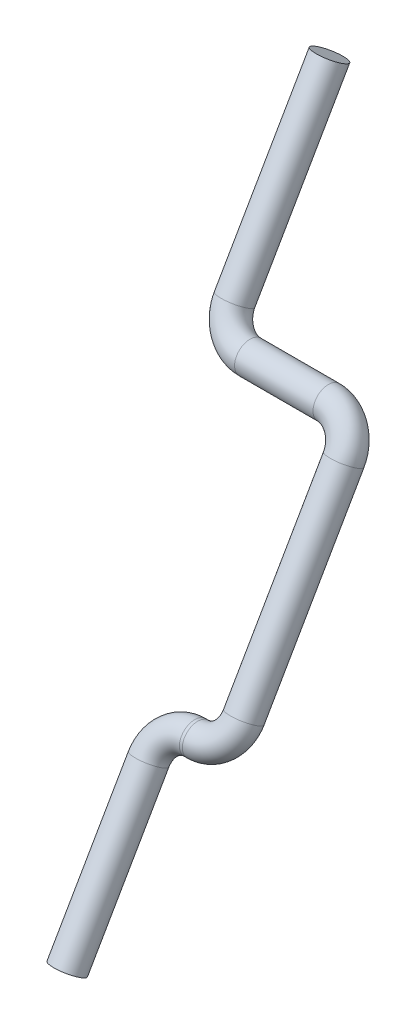
ISO-10303-21;
HEADER;
FILE_DESCRIPTION(('STEP AP214'),'2;1');
FILE_NAME('part.step','',(''),(''),'','','');
FILE_SCHEMA(('AUTOMOTIVE_DESIGN { 1 0 10303 214 1 1 1 1 }'));
ENDSEC;
DATA;
#1=APPLICATION_CONTEXT('core data for automotive mechanical design processes');
#2=APPLICATION_PROTOCOL_DEFINITION('international standard','automotive_design',2000,#1);
#3=PRODUCT_CONTEXT('',#1,'mechanical');
#4=PRODUCT('Part','Part','',(#3));
#5=PRODUCT_RELATED_PRODUCT_CATEGORY('part','',(#4));
#6=PRODUCT_DEFINITION_FORMATION('','',#4);
#7=PRODUCT_DEFINITION_CONTEXT('part definition',#1,'design');
#8=PRODUCT_DEFINITION('design','',#6,#7);
#9=PRODUCT_DEFINITION_SHAPE('','',#8);
#10=(LENGTH_UNIT() NAMED_UNIT(*) SI_UNIT(.MILLI.,.METRE.));
#11=(NAMED_UNIT(*) PLANE_ANGLE_UNIT() SI_UNIT($,.RADIAN.));
#12=(NAMED_UNIT(*) SI_UNIT($,.STERADIAN.) SOLID_ANGLE_UNIT());
#13=UNCERTAINTY_MEASURE_WITH_UNIT(LENGTH_MEASURE(1.E-05),#10,'distance_accuracy_value','');
#14=(GEOMETRIC_REPRESENTATION_CONTEXT(3) GLOBAL_UNCERTAINTY_ASSIGNED_CONTEXT((#13)) GLOBAL_UNIT_ASSIGNED_CONTEXT((#10,
#11,#12)) REPRESENTATION_CONTEXT('',''));
#15=CARTESIAN_POINT('',(0.,0.,0.));
#16=DIRECTION('',(0.,0.,1.));
#17=DIRECTION('',(1.,0.,0.));
#18=AXIS2_PLACEMENT_3D('',#15,#16,#17);
#19=CARTESIAN_POINT('',(-35.9480532512372,25.4978861657786,15.4144292044763));
#20=DIRECTION('',(0.,-0.866025403784439,0.5));
#21=DIRECTION('',(0.,-0.5,-0.866025403784439));
#22=AXIS2_PLACEMENT_3D('',#19,#20,#21);
#23=PLANE('',#22);
#24=CARTESIAN_POINT('',(-35.9480532512372,25.4978861657786,15.4144292044763));
#25=DIRECTION('',(0.,0.866025403784438,-0.5));
#26=DIRECTION('',(0.,0.5,0.866025403784438));
#27=AXIS2_PLACEMENT_3D('',#24,#25,#26);
#28=CIRCLE('',#27,0.499999999999999);
#29=CARTESIAN_POINT('',(-35.9480532512372,25.7478861657786,15.8474419063686));
#30=VERTEX_POINT('',#29);
#31=EDGE_CURVE('E17',#30,#30,#28,.F.);
#32=ORIENTED_EDGE('',*,*,#31,.F.);
#33=EDGE_LOOP('',(#32));
#34=FACE_BOUND('',#33,.T.);
#35=ADVANCED_FACE('F14',(#34),#23,.F.);
#36=CARTESIAN_POINT('',(-35.9480532512372,20.1505890965448,18.5016926068354));
#37=DIRECTION('',(0.,0.866025403784438,-0.5));
#38=DIRECTION('',(0.,0.5,0.866025403784438));
#39=AXIS2_PLACEMENT_3D('',#36,#37,#38);
#40=CYLINDRICAL_SURFACE('',#39,0.499999999999999);
#41=CARTESIAN_POINT('',(-35.9480532512371,20.1505890965447,18.5016926068354));
#42=DIRECTION('',(0.,0.866025403784439,-0.5));
#43=DIRECTION('',(-1.,0.,0.));
#44=AXIS2_PLACEMENT_3D('',#41,#42,#43);
#45=CIRCLE('',#44,0.5);
#46=CARTESIAN_POINT('',(-36.4480532512371,20.1505890965447,18.5016926068354));
#47=VERTEX_POINT('',#46);
#48=EDGE_CURVE('E85',#47,#47,#45,.F.);
#49=ORIENTED_EDGE('',*,*,#48,.F.);
#50=EDGE_LOOP('',(#49));
#51=FACE_BOUND('',#50,.T.);
#52=ORIENTED_EDGE('',*,*,#31,.T.);
#53=EDGE_LOOP('',(#52));
#54=FACE_BOUND('',#53,.T.);
#55=ADVANCED_FACE('F100',(#51,#54),#40,.T.);
#56=CARTESIAN_POINT('',(-33.4930692562999,6.47045995486214,26.3999188493347));
#57=DIRECTION('',(0.,-0.866025403784439,0.5));
#58=DIRECTION('',(0.,-0.5,-0.866025403784439));
#59=AXIS2_PLACEMENT_3D('',#56,#57,#58);
#60=PLANE('',#59);
#61=CARTESIAN_POINT('',(-33.4930692562999,6.47045995486214,26.3999188493347));
#62=DIRECTION('',(0.,-0.866025403784438,0.5));
#63=DIRECTION('',(0.,-0.5,-0.866025403784438));
#64=AXIS2_PLACEMENT_3D('',#61,#62,#63);
#65=CIRCLE('',#64,0.499999999999999);
#66=CARTESIAN_POINT('',(-33.4930692562999,6.22045995486214,25.9669061474425));
#67=VERTEX_POINT('',#66);
#68=EDGE_CURVE('E88',#67,#67,#65,.F.);
#69=ORIENTED_EDGE('',*,*,#68,.F.);
#70=EDGE_LOOP('',(#69));
#71=FACE_BOUND('',#70,.T.);
#72=ADVANCED_FACE('F78',(#71),#60,.T.);
#73=CARTESIAN_POINT('',(-34.9480532512372,20.1505890965448,18.5016926068354));
#74=DIRECTION('',(0.,-0.5,-0.866025403784439));
#75=DIRECTION('',(0.,-0.866025403784439,0.5));
#76=AXIS2_PLACEMENT_3D('',#73,#74,#75);
#77=TOROIDAL_SURFACE('',#76,1.,0.5);
#78=CARTESIAN_POINT('',(-34.9480532512372,19.2845636927603,19.0016926068354));
#79=DIRECTION('',(-1.,0.,0.));
#80=DIRECTION('',(0.,-1.,0.));
#81=AXIS2_PLACEMENT_3D('',#78,#79,#80);
#82=CIRCLE('',#81,0.5);
#83=CARTESIAN_POINT('',(-34.9480532512372,18.7845636927603,19.0016926068354));
#84=VERTEX_POINT('',#83);
#85=EDGE_CURVE('E61',#84,#84,#82,.F.);
#86=ORIENTED_EDGE('',*,*,#85,.F.);
#87=EDGE_LOOP('',(#86));
#88=FACE_BOUND('',#87,.T.);
#89=ORIENTED_EDGE('',*,*,#48,.T.);
#90=EDGE_LOOP('',(#89));
#91=FACE_BOUND('',#90,.T.);
#92=ADVANCED_FACE('F74',(#88,#91),#77,.T.);
#93=CARTESIAN_POINT('',(-33.4930692562999,11.0573614665481,23.7516700268165));
#94=DIRECTION('',(0.,-0.866025403784438,0.5));
#95=DIRECTION('',(0.,-0.5,-0.866025403784438));
#96=AXIS2_PLACEMENT_3D('',#93,#94,#95);
#97=CYLINDRICAL_SURFACE('',#96,0.499999999999999);
#98=CARTESIAN_POINT('',(-33.4930692562999,11.0573614665481,23.7516700268166));
#99=DIRECTION('',(0.,0.866025403784439,-0.5));
#100=DIRECTION('',(-1.,0.,0.));
#101=AXIS2_PLACEMENT_3D('',#98,#99,#100);
#102=CIRCLE('',#101,0.5);
#103=CARTESIAN_POINT('',(-33.9930692562999,11.0573614665481,23.7516700268166));
#104=VERTEX_POINT('',#103);
#105=EDGE_CURVE('E58',#104,#104,#102,.T.);
#106=ORIENTED_EDGE('',*,*,#105,.F.);
#107=EDGE_LOOP('',(#106));
#108=FACE_BOUND('',#107,.T.);
#109=ORIENTED_EDGE('',*,*,#68,.T.);
#110=EDGE_LOOP('',(#109));
#111=FACE_BOUND('',#110,.T.);
#112=ADVANCED_FACE('F70',(#108,#111),#97,.T.);
#113=CARTESIAN_POINT('',(-32.3974457071617,19.2845636927603,19.0016926068354));
#114=DIRECTION('',(-1.,0.,0.));
#115=DIRECTION('',(0.,-1.,0.));
#116=AXIS2_PLACEMENT_3D('',#113,#114,#115);
#117=CYLINDRICAL_SURFACE('',#116,0.5);
#118=CARTESIAN_POINT('',(-32.3974457071616,19.2845636927603,19.0016926068354));
#119=DIRECTION('',(-1.,0.,0.));
#120=DIRECTION('',(0.,0.866025403784438,-0.500000000000002));
#121=AXIS2_PLACEMENT_3D('',#118,#119,#120);
#122=CIRCLE('',#121,0.5);
#123=CARTESIAN_POINT('',(-32.3974457071616,19.7175763946526,18.7516926068354));
#124=VERTEX_POINT('',#123);
#125=EDGE_CURVE('E54',#124,#124,#122,.F.);
#126=ORIENTED_EDGE('',*,*,#125,.F.);
#127=EDGE_LOOP('',(#126));
#128=FACE_BOUND('',#127,.T.);
#129=ORIENTED_EDGE('',*,*,#85,.T.);
#130=EDGE_LOOP('',(#129));
#131=FACE_BOUND('',#130,.T.);
#132=ADVANCED_FACE('F66',(#128,#131),#117,.T.);
#133=CARTESIAN_POINT('',(-32.4930692562999,11.0573614665481,23.7516700268165));
#134=DIRECTION('',(0.,-0.5,-0.866025403784439));
#135=DIRECTION('',(0.,-0.866025403784439,0.5));
#136=AXIS2_PLACEMENT_3D('',#133,#134,#135);
#137=TOROIDAL_SURFACE('',#136,1.,0.5);
#138=ORIENTED_EDGE('',*,*,#105,.T.);
#139=EDGE_LOOP('',(#138));
#140=FACE_BOUND('',#139,.T.);
#141=CARTESIAN_POINT('',(-32.4930692562999,11.9233868703325,23.2516700268165));
#142=DIRECTION('',(1.,0.,0.));
#143=DIRECTION('',(0.,1.,0.));
#144=AXIS2_PLACEMENT_3D('',#141,#142,#143);
#145=CIRCLE('',#144,0.5);
#146=CARTESIAN_POINT('',(-32.4930692562999,12.4233868703325,23.2516700268165));
#147=VERTEX_POINT('',#146);
#148=EDGE_CURVE('E51',#147,#147,#145,.T.);
#149=ORIENTED_EDGE('',*,*,#148,.F.);
#150=EDGE_LOOP('',(#149));
#151=FACE_BOUND('',#150,.T.);
#152=ADVANCED_FACE('F63',(#140,#151),#137,.T.);
#153=CARTESIAN_POINT('',(-32.4930692562999,11.9233868703325,23.2516700268165));
#154=DIRECTION('',(1.,0.,0.));
#155=DIRECTION('',(0.,1.,0.));
#156=AXIS2_PLACEMENT_3D('',#153,#154,#155);
#157=CYLINDRICAL_SURFACE('',#156,0.5);
#158=ORIENTED_EDGE('',*,*,#148,.T.);
#159=EDGE_LOOP('',(#158));
#160=FACE_BOUND('',#159,.T.);
#161=CARTESIAN_POINT('',(-32.3974457071616,11.9233868703325,23.2516700268165));
#162=DIRECTION('',(1.,0.,0.));
#163=DIRECTION('',(0.,-0.866025403784439,0.5));
#164=AXIS2_PLACEMENT_3D('',#161,#162,#163);
#165=CIRCLE('',#164,0.5);
#166=CARTESIAN_POINT('',(-32.3974457071616,11.4903741684403,23.5016700268165));
#167=VERTEX_POINT('',#166);
#168=EDGE_CURVE('E30',#167,#167,#165,.T.);
#169=ORIENTED_EDGE('',*,*,#168,.F.);
#170=EDGE_LOOP('',(#169));
#171=FACE_BOUND('',#170,.T.);
#172=ADVANCED_FACE('F46',(#160,#171),#157,.T.);
#173=CARTESIAN_POINT('',(-32.3974457071616,18.4185382889759,19.5016926068354));
#174=DIRECTION('',(0.,0.5,0.866025403784439));
#175=DIRECTION('',(0.,0.866025403784439,-0.5));
#176=AXIS2_PLACEMENT_3D('',#173,#174,#175);
#177=TOROIDAL_SURFACE('',#176,1.,0.5);
#178=CARTESIAN_POINT('',(-31.3974457071616,18.4185382889759,19.5016926068354));
#179=DIRECTION('',(0.,0.866025403784438,-0.5));
#180=DIRECTION('',(0.,0.5,0.866025403784438));
#181=AXIS2_PLACEMENT_3D('',#178,#179,#180);
#182=CIRCLE('',#181,0.499999999999999);
#183=CARTESIAN_POINT('',(-31.3974457071616,18.6685382889759,19.9347053087276));
#184=VERTEX_POINT('',#183);
#185=EDGE_CURVE('E22',#184,#184,#182,.F.);
#186=ORIENTED_EDGE('',*,*,#185,.F.);
#187=EDGE_LOOP('',(#186));
#188=FACE_BOUND('',#187,.T.);
#189=ORIENTED_EDGE('',*,*,#125,.T.);
#190=EDGE_LOOP('',(#189));
#191=FACE_BOUND('',#190,.T.);
#192=ADVANCED_FACE('F42',(#188,#191),#177,.T.);
#193=CARTESIAN_POINT('',(-32.3974457071616,12.789412274117,22.7516700268165));
#194=DIRECTION('',(0.,0.5,0.866025403784439));
#195=DIRECTION('',(0.,0.866025403784439,-0.5));
#196=AXIS2_PLACEMENT_3D('',#193,#194,#195);
#197=TOROIDAL_SURFACE('',#196,1.,0.5);
#198=ORIENTED_EDGE('',*,*,#168,.T.);
#199=EDGE_LOOP('',(#198));
#200=FACE_BOUND('',#199,.T.);
#201=CARTESIAN_POINT('',(-31.3974457071616,12.789412274117,22.7516700268165));
#202=DIRECTION('',(0.,0.866025403784438,-0.5));
#203=DIRECTION('',(0.,0.5,0.866025403784438));
#204=AXIS2_PLACEMENT_3D('',#201,#202,#203);
#205=CIRCLE('',#204,0.499999999999999);
#206=CARTESIAN_POINT('',(-31.3974457071616,13.039412274117,23.1846827287087));
#207=VERTEX_POINT('',#206);
#208=EDGE_CURVE('E10',#207,#207,#205,.T.);
#209=ORIENTED_EDGE('',*,*,#208,.F.);
#210=EDGE_LOOP('',(#209));
#211=FACE_BOUND('',#210,.T.);
#212=ADVANCED_FACE('F37',(#200,#211),#197,.T.);
#213=CARTESIAN_POINT('',(-31.3974457071616,12.789412274117,22.7516700268165));
#214=DIRECTION('',(0.,0.866025403784438,-0.5));
#215=DIRECTION('',(0.,0.5,0.866025403784438));
#216=AXIS2_PLACEMENT_3D('',#213,#214,#215);
#217=CYLINDRICAL_SURFACE('',#216,0.499999999999999);
#218=ORIENTED_EDGE('',*,*,#208,.T.);
#219=EDGE_LOOP('',(#218));
#220=FACE_BOUND('',#219,.T.);
#221=ORIENTED_EDGE('',*,*,#185,.T.);
#222=EDGE_LOOP('',(#221));
#223=FACE_BOUND('',#222,.T.);
#224=ADVANCED_FACE('F41',(#220,#223),#217,.T.);
#225=CLOSED_SHELL('',(#35,#55,#72,#92,#112,#132,#152,#172,#192,#212,#224));
#226=MANIFOLD_SOLID_BREP('B1',#225);
#227=ADVANCED_BREP_SHAPE_REPRESENTATION('',(#18,#226),#14);
#228=SHAPE_DEFINITION_REPRESENTATION(#9,#227);
ENDSEC;
END-ISO-10303-21;
